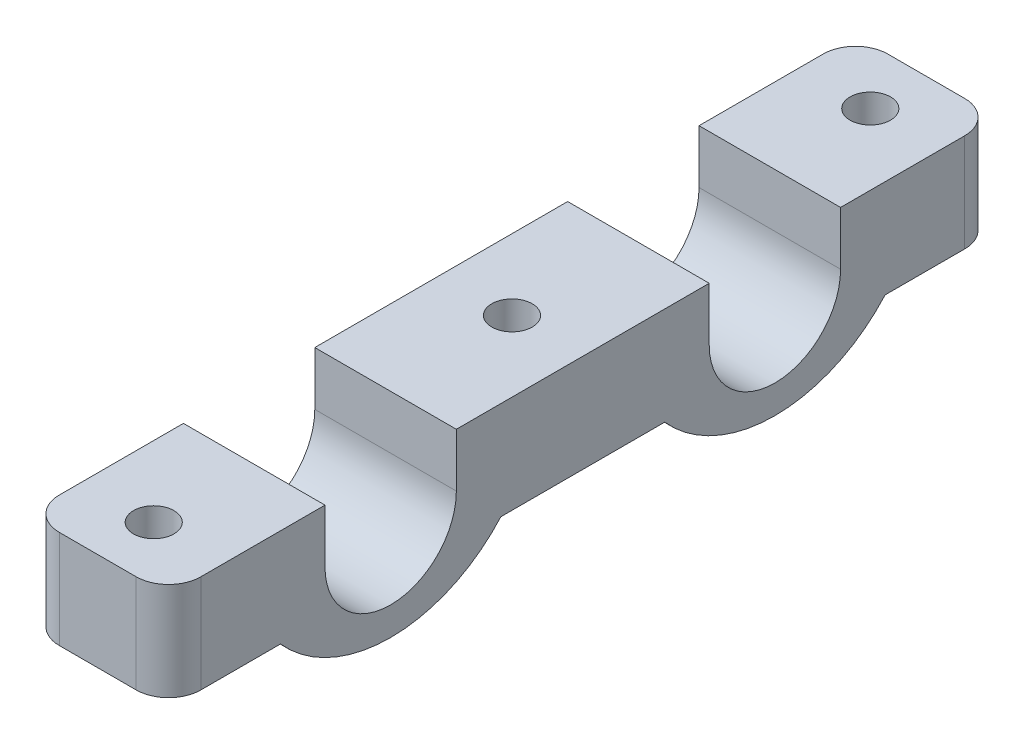
ISO-10303-21;
HEADER;
FILE_DESCRIPTION(('STEP AP214'),'2;1');
FILE_NAME('part.step','',(''),(''),'','','');
FILE_SCHEMA(('AUTOMOTIVE_DESIGN { 1 0 10303 214 1 1 1 1 }'));
ENDSEC;
DATA;
#1=APPLICATION_CONTEXT('core data for automotive mechanical design processes');
#2=APPLICATION_PROTOCOL_DEFINITION('international standard','automotive_design',2000,#1);
#3=PRODUCT_CONTEXT('',#1,'mechanical');
#4=PRODUCT('Part','Part','',(#3));
#5=PRODUCT_RELATED_PRODUCT_CATEGORY('part','',(#4));
#6=PRODUCT_DEFINITION_FORMATION('','',#4);
#7=PRODUCT_DEFINITION_CONTEXT('part definition',#1,'design');
#8=PRODUCT_DEFINITION('design','',#6,#7);
#9=PRODUCT_DEFINITION_SHAPE('','',#8);
#10=(LENGTH_UNIT() NAMED_UNIT(*) SI_UNIT(.MILLI.,.METRE.));
#11=(NAMED_UNIT(*) PLANE_ANGLE_UNIT() SI_UNIT($,.RADIAN.));
#12=(NAMED_UNIT(*) SI_UNIT($,.STERADIAN.) SOLID_ANGLE_UNIT());
#13=UNCERTAINTY_MEASURE_WITH_UNIT(LENGTH_MEASURE(1.E-05),#10,'distance_accuracy_value','');
#14=(GEOMETRIC_REPRESENTATION_CONTEXT(3) GLOBAL_UNCERTAINTY_ASSIGNED_CONTEXT((#13)) GLOBAL_UNIT_ASSIGNED_CONTEXT((#10,
#11,#12)) REPRESENTATION_CONTEXT('',''));
#15=CARTESIAN_POINT('',(0.,0.,0.));
#16=DIRECTION('',(0.,0.,1.));
#17=DIRECTION('',(1.,0.,0.));
#18=AXIS2_PLACEMENT_3D('',#15,#16,#17);
#19=CARTESIAN_POINT('',(17.5,-23.241,-47.5));
#20=DIRECTION('',(0.,1.,0.));
#21=DIRECTION('',(0.,0.,1.));
#22=AXIS2_PLACEMENT_3D('',#19,#20,#21);
#23=CYLINDRICAL_SURFACE('',#22,5.);
#24=CARTESIAN_POINT('',(17.5,13.24,-47.5));
#25=DIRECTION('',(0.,1.,0.));
#26=DIRECTION('',(0.,0.,1.));
#27=AXIS2_PLACEMENT_3D('',#24,#25,#26);
#28=CIRCLE('',#27,5.);
#29=CARTESIAN_POINT('',(17.5,13.24,-42.5));
#30=VERTEX_POINT('',#29);
#31=EDGE_CURVE('E686',#30,#30,#28,.T.);
#32=ORIENTED_EDGE('',*,*,#31,.T.);
#33=EDGE_LOOP('',(#32));
#34=FACE_BOUND('',#33,.T.);
#35=CARTESIAN_POINT('',(17.5,-0.999999999999997,-47.5));
#36=DIRECTION('',(0.,-1.,0.));
#37=DIRECTION('',(0.,0.,-1.));
#38=AXIS2_PLACEMENT_3D('',#35,#36,#37);
#39=CIRCLE('',#38,5.);
#40=CARTESIAN_POINT('',(17.5,-0.999999999999997,-52.5));
#41=VERTEX_POINT('',#40);
#42=EDGE_CURVE('E220',#41,#41,#39,.F.);
#43=ORIENTED_EDGE('',*,*,#42,.F.);
#44=EDGE_LOOP('',(#43));
#45=FACE_BOUND('',#44,.T.);
#46=ADVANCED_FACE('F41',(#34,#45),#23,.F.);
#47=CARTESIAN_POINT('',(17.5,-23.241,-136.080112359044));
#48=DIRECTION('',(0.,1.,0.));
#49=DIRECTION('',(0.,0.,1.));
#50=AXIS2_PLACEMENT_3D('',#47,#48,#49);
#51=CYLINDRICAL_SURFACE('',#50,5.);
#52=CARTESIAN_POINT('',(17.5,13.24,-136.080112359044));
#53=DIRECTION('',(0.,1.,0.));
#54=DIRECTION('',(0.,0.,-1.));
#55=AXIS2_PLACEMENT_3D('',#52,#53,#54);
#56=CIRCLE('',#55,5.);
#57=CARTESIAN_POINT('',(17.5,13.24,-141.080112359044));
#58=VERTEX_POINT('',#57);
#59=EDGE_CURVE('E225',#58,#58,#56,.T.);
#60=ORIENTED_EDGE('',*,*,#59,.T.);
#61=EDGE_LOOP('',(#60));
#62=FACE_BOUND('',#61,.T.);
#63=CARTESIAN_POINT('',(17.5,-0.999999999999997,-136.080112359044));
#64=DIRECTION('',(0.,-1.,0.));
#65=DIRECTION('',(0.,0.,-1.));
#66=AXIS2_PLACEMENT_3D('',#63,#64,#65);
#67=CIRCLE('',#66,5.);
#68=CARTESIAN_POINT('',(17.5,-0.999999999999997,-141.080112359044));
#69=VERTEX_POINT('',#68);
#70=EDGE_CURVE('E216',#69,#69,#67,.F.);
#71=ORIENTED_EDGE('',*,*,#70,.F.);
#72=EDGE_LOOP('',(#71));
#73=FACE_BOUND('',#72,.T.);
#74=ADVANCED_FACE('F402',(#62,#73),#51,.F.);
#75=CARTESIAN_POINT('',(17.5,-23.241,41.080112359044));
#76=DIRECTION('',(0.,1.,0.));
#77=DIRECTION('',(0.,0.,1.));
#78=AXIS2_PLACEMENT_3D('',#75,#76,#77);
#79=CYLINDRICAL_SURFACE('',#78,5.);
#80=CARTESIAN_POINT('',(17.5,13.24,41.080112359044));
#81=DIRECTION('',(0.,1.,0.));
#82=DIRECTION('',(0.,0.,1.));
#83=AXIS2_PLACEMENT_3D('',#80,#81,#82);
#84=CIRCLE('',#83,5.);
#85=CARTESIAN_POINT('',(17.5,13.24,46.080112359044));
#86=VERTEX_POINT('',#85);
#87=EDGE_CURVE('E371',#86,#86,#84,.T.);
#88=ORIENTED_EDGE('',*,*,#87,.T.);
#89=EDGE_LOOP('',(#88));
#90=FACE_BOUND('',#89,.T.);
#91=CARTESIAN_POINT('',(17.5,-0.999999999999997,41.080112359044));
#92=DIRECTION('',(0.,-1.,0.));
#93=DIRECTION('',(0.,0.,-1.));
#94=AXIS2_PLACEMENT_3D('',#91,#92,#93);
#95=CIRCLE('',#94,5.);
#96=CARTESIAN_POINT('',(17.5,-0.999999999999997,36.080112359044));
#97=VERTEX_POINT('',#96);
#98=EDGE_CURVE('E214',#97,#97,#95,.F.);
#99=ORIENTED_EDGE('',*,*,#98,.F.);
#100=EDGE_LOOP('',(#99));
#101=FACE_BOUND('',#100,.T.);
#102=ADVANCED_FACE('F409',(#90,#101),#79,.F.);
#103=CARTESIAN_POINT('',(35.,0.,0.));
#104=DIRECTION('',(-1.,0.,0.));
#105=DIRECTION('',(0.,0.,1.));
#106=AXIS2_PLACEMENT_3D('',#103,#104,#105);
#107=CYLINDRICAL_SURFACE('',#106,16.24);
#108=CARTESIAN_POINT('',(0.,0.,0.));
#109=DIRECTION('',(-1.,0.,0.));
#110=DIRECTION('',(0.,0.,-1.));
#111=AXIS2_PLACEMENT_3D('',#108,#109,#110);
#112=CIRCLE('',#111,16.24);
#113=CARTESIAN_POINT('',(0.,0.,-16.24));
#114=VERTEX_POINT('',#113);
#115=CARTESIAN_POINT('',(0.,0.,16.24));
#116=VERTEX_POINT('',#115);
#117=EDGE_CURVE('E201',#114,#116,#112,.T.);
#118=ORIENTED_EDGE('',*,*,#117,.T.);
#119=DIRECTION('',(-1.,0.,0.));
#120=VECTOR('',#119,1.);
#121=CARTESIAN_POINT('',(35.,0.,16.24));
#122=LINE('',#121,#120);
#123=CARTESIAN_POINT('',(35.,0.,16.24));
#124=VERTEX_POINT('',#123);
#125=EDGE_CURVE('E185',#124,#116,#122,.T.);
#126=ORIENTED_EDGE('',*,*,#125,.F.);
#127=CARTESIAN_POINT('',(35.,0.,0.));
#128=DIRECTION('',(-1.,0.,0.));
#129=DIRECTION('',(0.,0.,-1.));
#130=AXIS2_PLACEMENT_3D('',#127,#128,#129);
#131=CIRCLE('',#130,16.24);
#132=CARTESIAN_POINT('',(35.,0.,-16.24));
#133=VERTEX_POINT('',#132);
#134=EDGE_CURVE('E188',#133,#124,#131,.T.);
#135=ORIENTED_EDGE('',*,*,#134,.F.);
#136=DIRECTION('',(-1.,0.,0.));
#137=VECTOR('',#136,1.);
#138=CARTESIAN_POINT('',(35.,0.,-16.24));
#139=LINE('',#138,#137);
#140=EDGE_CURVE('E335',#133,#114,#139,.T.);
#141=ORIENTED_EDGE('',*,*,#140,.T.);
#142=EDGE_LOOP('',(#118,#126,#135,#141));
#143=FACE_BOUND('',#142,.T.);
#144=ADVANCED_FACE('F203',(#143),#107,.F.);
#145=CARTESIAN_POINT('',(35.,13.24,16.24));
#146=DIRECTION('',(0.,0.,1.));
#147=DIRECTION('',(1.,0.,0.));
#148=AXIS2_PLACEMENT_3D('',#145,#146,#147);
#149=PLANE('',#148);
#150=DIRECTION('',(0.,1.,0.));
#151=VECTOR('',#150,1.);
#152=CARTESIAN_POINT('',(0.,13.24,16.24));
#153=LINE('',#152,#151);
#154=CARTESIAN_POINT('',(0.,13.24,16.24));
#155=VERTEX_POINT('',#154);
#156=EDGE_CURVE('E315',#116,#155,#153,.T.);
#157=ORIENTED_EDGE('',*,*,#156,.T.);
#158=DIRECTION('',(-1.,0.,0.));
#159=VECTOR('',#158,1.);
#160=CARTESIAN_POINT('',(35.,13.24,16.24));
#161=LINE('',#160,#159);
#162=CARTESIAN_POINT('',(35.,13.24,16.24));
#163=VERTEX_POINT('',#162);
#164=EDGE_CURVE('E184',#163,#155,#161,.T.);
#165=ORIENTED_EDGE('',*,*,#164,.F.);
#166=DIRECTION('',(0.,1.,0.));
#167=VECTOR('',#166,1.);
#168=CARTESIAN_POINT('',(35.,13.24,16.24));
#169=LINE('',#168,#167);
#170=EDGE_CURVE('E178',#124,#163,#169,.T.);
#171=ORIENTED_EDGE('',*,*,#170,.F.);
#172=ORIENTED_EDGE('',*,*,#125,.T.);
#173=EDGE_LOOP('',(#157,#165,#171,#172));
#174=FACE_BOUND('',#173,.T.);
#175=ADVANCED_FACE('F179',(#174),#149,.F.);
#176=CARTESIAN_POINT('',(35.,13.24,54.9202247180879));
#177=DIRECTION('',(0.,-1.,0.));
#178=DIRECTION('',(0.,0.,-1.));
#179=AXIS2_PLACEMENT_3D('',#176,#177,#178);
#180=PLANE('',#179);
#181=ORIENTED_EDGE('',*,*,#87,.F.);
#182=EDGE_LOOP('',(#181));
#183=FACE_BOUND('',#182,.T.);
#184=DIRECTION('',(-1.,0.,0.));
#185=VECTOR('',#184,1.);
#186=CARTESIAN_POINT('',(35.,13.24,54.9202247180879));
#187=LINE('',#186,#185);
#188=CARTESIAN_POINT('',(27.,13.24,54.9202247180879));
#189=VERTEX_POINT('',#188);
#190=CARTESIAN_POINT('',(8.,13.24,54.9202247180879));
#191=VERTEX_POINT('',#190);
#192=EDGE_CURVE('E209',#189,#191,#187,.T.);
#193=ORIENTED_EDGE('',*,*,#192,.F.);
#194=CARTESIAN_POINT('',(27.,13.24,46.9202247180879));
#195=DIRECTION('',(0.,-1.,0.));
#196=DIRECTION('',(0.,0.,-1.));
#197=AXIS2_PLACEMENT_3D('',#194,#195,#196);
#198=CIRCLE('',#197,8.);
#199=CARTESIAN_POINT('',(35.,13.24,46.9202247180879));
#200=VERTEX_POINT('',#199);
#201=EDGE_CURVE('E240',#189,#200,#198,.F.);
#202=ORIENTED_EDGE('',*,*,#201,.T.);
#203=DIRECTION('',(0.,0.,1.));
#204=VECTOR('',#203,1.);
#205=CARTESIAN_POINT('',(35.,13.24,54.9202247180879));
#206=LINE('',#205,#204);
#207=EDGE_CURVE('E186',#163,#200,#206,.T.);
#208=ORIENTED_EDGE('',*,*,#207,.F.);
#209=ORIENTED_EDGE('',*,*,#164,.T.);
#210=DIRECTION('',(0.,0.,1.));
#211=VECTOR('',#210,1.);
#212=CARTESIAN_POINT('',(0.,13.24,54.9202247180879));
#213=LINE('',#212,#211);
#214=CARTESIAN_POINT('',(0.,13.24,46.9202247180879));
#215=VERTEX_POINT('',#214);
#216=EDGE_CURVE('E308',#155,#215,#213,.T.);
#217=ORIENTED_EDGE('',*,*,#216,.T.);
#218=CARTESIAN_POINT('',(8.,13.24,46.9202247180879));
#219=DIRECTION('',(0.,-1.,0.));
#220=DIRECTION('',(0.,0.,-1.));
#221=AXIS2_PLACEMENT_3D('',#218,#219,#220);
#222=CIRCLE('',#221,8.);
#223=EDGE_CURVE('E232',#215,#191,#222,.F.);
#224=ORIENTED_EDGE('',*,*,#223,.T.);
#225=EDGE_LOOP('',(#193,#202,#208,#209,#217,#224));
#226=FACE_BOUND('',#225,.T.);
#227=ADVANCED_FACE('F375',(#183,#226),#180,.F.);
#228=CARTESIAN_POINT('',(35.,0.,54.9202247180879));
#229=DIRECTION('',(0.,0.,-1.));
#230=DIRECTION('',(-1.,0.,0.));
#231=AXIS2_PLACEMENT_3D('',#228,#229,#230);
#232=PLANE('',#231);
#233=DIRECTION('',(-1.,0.,0.));
#234=VECTOR('',#233,1.);
#235=CARTESIAN_POINT('',(35.,-11.,54.9202247180879));
#236=LINE('',#235,#234);
#237=CARTESIAN_POINT('',(27.,-11.,54.9202247180879));
#238=VERTEX_POINT('',#237);
#239=CARTESIAN_POINT('',(8.,-11.,54.9202247180879));
#240=VERTEX_POINT('',#239);
#241=EDGE_CURVE('E278',#238,#240,#236,.T.);
#242=ORIENTED_EDGE('',*,*,#241,.F.);
#243=DIRECTION('',(0.,-1.,0.));
#244=VECTOR('',#243,1.);
#245=CARTESIAN_POINT('',(27.,13.24,54.9202247180879));
#246=LINE('',#245,#244);
#247=EDGE_CURVE('E231',#238,#189,#246,.F.);
#248=ORIENTED_EDGE('',*,*,#247,.T.);
#249=ORIENTED_EDGE('',*,*,#192,.T.);
#250=DIRECTION('',(0.,-1.,0.));
#251=VECTOR('',#250,1.);
#252=CARTESIAN_POINT('',(8.,0.,54.9202247180879));
#253=LINE('',#252,#251);
#254=EDGE_CURVE('E229',#191,#240,#253,.T.);
#255=ORIENTED_EDGE('',*,*,#254,.T.);
#256=EDGE_LOOP('',(#242,#248,#249,#255));
#257=FACE_BOUND('',#256,.T.);
#258=ADVANCED_FACE('F290',(#257),#232,.F.);
#259=CARTESIAN_POINT('',(35.,-11.,27.24));
#260=DIRECTION('',(0.,1.,0.));
#261=DIRECTION('',(0.,0.,1.));
#262=AXIS2_PLACEMENT_3D('',#259,#260,#261);
#263=PLANE('',#262);
#264=CARTESIAN_POINT('',(17.5,-11.,41.080112359044));
#265=DIRECTION('',(0.,-1.,0.));
#266=DIRECTION('',(0.,0.,-1.));
#267=AXIS2_PLACEMENT_3D('',#264,#265,#266);
#268=CIRCLE('',#267,10.5);
#269=CARTESIAN_POINT('',(17.5,-11.,30.580112359044));
#270=VERTEX_POINT('',#269);
#271=EDGE_CURVE('E710',#270,#270,#268,.T.);
#272=ORIENTED_EDGE('',*,*,#271,.F.);
#273=EDGE_LOOP('',(#272));
#274=FACE_BOUND('',#273,.T.);
#275=DIRECTION('',(0.,0.,-1.));
#276=VECTOR('',#275,1.);
#277=CARTESIAN_POINT('',(35.,-11.,27.24));
#278=LINE('',#277,#276);
#279=CARTESIAN_POINT('',(35.,-11.,46.9202247180879));
#280=VERTEX_POINT('',#279);
#281=CARTESIAN_POINT('',(35.,-11.,27.24));
#282=VERTEX_POINT('',#281);
#283=EDGE_CURVE('E372',#280,#282,#278,.T.);
#284=ORIENTED_EDGE('',*,*,#283,.F.);
#285=CARTESIAN_POINT('',(27.,-11.,46.9202247180879));
#286=DIRECTION('',(0.,1.,0.));
#287=DIRECTION('',(0.,0.,1.));
#288=AXIS2_PLACEMENT_3D('',#285,#286,#287);
#289=CIRCLE('',#288,8.);
#290=EDGE_CURVE('E226',#280,#238,#289,.F.);
#291=ORIENTED_EDGE('',*,*,#290,.T.);
#292=ORIENTED_EDGE('',*,*,#241,.T.);
#293=CARTESIAN_POINT('',(8.,-11.,46.9202247180879));
#294=DIRECTION('',(0.,1.,0.));
#295=DIRECTION('',(0.,0.,1.));
#296=AXIS2_PLACEMENT_3D('',#293,#294,#295);
#297=CIRCLE('',#296,8.);
#298=CARTESIAN_POINT('',(0.,-11.,46.9202247180879));
#299=VERTEX_POINT('',#298);
#300=EDGE_CURVE('E228',#240,#299,#297,.F.);
#301=ORIENTED_EDGE('',*,*,#300,.T.);
#302=DIRECTION('',(0.,0.,-1.));
#303=VECTOR('',#302,1.);
#304=CARTESIAN_POINT('',(0.,-11.,27.24));
#305=LINE('',#304,#303);
#306=CARTESIAN_POINT('',(0.,-11.,27.24));
#307=VERTEX_POINT('',#306);
#308=EDGE_CURVE('E297',#299,#307,#305,.T.);
#309=ORIENTED_EDGE('',*,*,#308,.T.);
#310=DIRECTION('',(-1.,0.,0.));
#311=VECTOR('',#310,1.);
#312=CARTESIAN_POINT('',(35.,-11.,27.24));
#313=LINE('',#312,#311);
#314=EDGE_CURVE('E280',#282,#307,#313,.T.);
#315=ORIENTED_EDGE('',*,*,#314,.F.);
#316=EDGE_LOOP('',(#284,#291,#292,#301,#309,#315));
#317=FACE_BOUND('',#316,.T.);
#318=ADVANCED_FACE('F296',(#274,#317),#263,.F.);
#319=CARTESIAN_POINT('',(35.,13.1911764705882,0.));
#320=DIRECTION('',(-1.,0.,0.));
#321=DIRECTION('',(0.,0.,1.));
#322=AXIS2_PLACEMENT_3D('',#319,#320,#321);
#323=CYLINDRICAL_SURFACE('',#322,36.4311764705882);
#324=CARTESIAN_POINT('',(0.,13.1911764705882,0.));
#325=DIRECTION('',(1.,0.,0.));
#326=DIRECTION('',(0.,0.,-1.));
#327=AXIS2_PLACEMENT_3D('',#324,#325,#326);
#328=CIRCLE('',#327,36.4311764705882);
#329=CARTESIAN_POINT('',(0.,-11.,-27.24));
#330=VERTEX_POINT('',#329);
#331=EDGE_CURVE('E310',#307,#330,#328,.T.);
#332=ORIENTED_EDGE('',*,*,#331,.T.);
#333=DIRECTION('',(-1.,0.,0.));
#334=VECTOR('',#333,1.);
#335=CARTESIAN_POINT('',(35.,-11.,-27.24));
#336=LINE('',#335,#334);
#337=CARTESIAN_POINT('',(35.,-11.,-27.24));
#338=VERTEX_POINT('',#337);
#339=EDGE_CURVE('E274',#338,#330,#336,.T.);
#340=ORIENTED_EDGE('',*,*,#339,.F.);
#341=CARTESIAN_POINT('',(35.,13.1911764705882,0.));
#342=DIRECTION('',(1.,0.,0.));
#343=DIRECTION('',(0.,0.,-1.));
#344=AXIS2_PLACEMENT_3D('',#341,#342,#343);
#345=CIRCLE('',#344,36.4311764705882);
#346=EDGE_CURVE('E376',#282,#338,#345,.T.);
#347=ORIENTED_EDGE('',*,*,#346,.F.);
#348=ORIENTED_EDGE('',*,*,#314,.T.);
#349=EDGE_LOOP('',(#332,#340,#347,#348));
#350=FACE_BOUND('',#349,.T.);
#351=ADVANCED_FACE('F446',(#350),#323,.T.);
#352=CARTESIAN_POINT('',(35.,-11.,-27.24));
#353=DIRECTION('',(0.,1.,0.));
#354=DIRECTION('',(0.,0.,1.));
#355=AXIS2_PLACEMENT_3D('',#352,#353,#354);
#356=PLANE('',#355);
#357=CARTESIAN_POINT('',(17.5,-11.,-47.5));
#358=DIRECTION('',(0.,-1.,0.));
#359=DIRECTION('',(0.,0.,-1.));
#360=AXIS2_PLACEMENT_3D('',#357,#358,#359);
#361=CIRCLE('',#360,10.5);
#362=CARTESIAN_POINT('',(17.5,-11.,-58.));
#363=VERTEX_POINT('',#362);
#364=EDGE_CURVE('E695',#363,#363,#361,.T.);
#365=ORIENTED_EDGE('',*,*,#364,.F.);
#366=EDGE_LOOP('',(#365));
#367=FACE_BOUND('',#366,.T.);
#368=DIRECTION('',(0.,0.,-1.));
#369=VECTOR('',#368,1.);
#370=CARTESIAN_POINT('',(0.,-11.,-27.24));
#371=LINE('',#370,#369);
#372=CARTESIAN_POINT('',(0.,-11.,-67.76));
#373=VERTEX_POINT('',#372);
#374=EDGE_CURVE('E309',#330,#373,#371,.T.);
#375=ORIENTED_EDGE('',*,*,#374,.T.);
#376=DIRECTION('',(-1.,0.,0.));
#377=VECTOR('',#376,1.);
#378=CARTESIAN_POINT('',(35.,-11.,-67.76));
#379=LINE('',#378,#377);
#380=CARTESIAN_POINT('',(35.,-11.,-67.76));
#381=VERTEX_POINT('',#380);
#382=EDGE_CURVE('E272',#381,#373,#379,.T.);
#383=ORIENTED_EDGE('',*,*,#382,.F.);
#384=DIRECTION('',(0.,0.,-1.));
#385=VECTOR('',#384,1.);
#386=CARTESIAN_POINT('',(35.,-11.,-27.24));
#387=LINE('',#386,#385);
#388=EDGE_CURVE('E379',#338,#381,#387,.T.);
#389=ORIENTED_EDGE('',*,*,#388,.F.);
#390=ORIENTED_EDGE('',*,*,#339,.T.);
#391=EDGE_LOOP('',(#375,#383,#389,#390));
#392=FACE_BOUND('',#391,.T.);
#393=ADVANCED_FACE('F444',(#367,#392),#356,.F.);
#394=CARTESIAN_POINT('',(35.,13.1911764705882,-95.));
#395=DIRECTION('',(-1.,0.,0.));
#396=DIRECTION('',(0.,0.,1.));
#397=AXIS2_PLACEMENT_3D('',#394,#395,#396);
#398=CYLINDRICAL_SURFACE('',#397,36.4311764705882);
#399=CARTESIAN_POINT('',(0.,13.1911764705882,-95.));
#400=DIRECTION('',(1.,0.,0.));
#401=DIRECTION('',(0.,0.,-1.));
#402=AXIS2_PLACEMENT_3D('',#399,#400,#401);
#403=CIRCLE('',#402,36.4311764705882);
#404=CARTESIAN_POINT('',(0.,-11.,-122.24));
#405=VERTEX_POINT('',#404);
#406=EDGE_CURVE('E320',#373,#405,#403,.T.);
#407=ORIENTED_EDGE('',*,*,#406,.T.);
#408=DIRECTION('',(-1.,0.,0.));
#409=VECTOR('',#408,1.);
#410=CARTESIAN_POINT('',(35.,-11.,-122.24));
#411=LINE('',#410,#409);
#412=CARTESIAN_POINT('',(35.,-11.,-122.24));
#413=VERTEX_POINT('',#412);
#414=EDGE_CURVE('E262',#413,#405,#411,.T.);
#415=ORIENTED_EDGE('',*,*,#414,.F.);
#416=CARTESIAN_POINT('',(35.,13.1911764705882,-95.));
#417=DIRECTION('',(1.,0.,0.));
#418=DIRECTION('',(0.,0.,-1.));
#419=AXIS2_PLACEMENT_3D('',#416,#417,#418);
#420=CIRCLE('',#419,36.4311764705882);
#421=EDGE_CURVE('E385',#381,#413,#420,.T.);
#422=ORIENTED_EDGE('',*,*,#421,.F.);
#423=ORIENTED_EDGE('',*,*,#382,.T.);
#424=EDGE_LOOP('',(#407,#415,#422,#423));
#425=FACE_BOUND('',#424,.T.);
#426=ADVANCED_FACE('F441',(#425),#398,.T.);
#427=CARTESIAN_POINT('',(35.,-11.,-122.24));
#428=DIRECTION('',(0.,1.,0.));
#429=DIRECTION('',(0.,0.,1.));
#430=AXIS2_PLACEMENT_3D('',#427,#428,#429);
#431=PLANE('',#430);
#432=CARTESIAN_POINT('',(17.5,-11.,-136.080112359044));
#433=DIRECTION('',(0.,-1.,0.));
#434=DIRECTION('',(0.,0.,-1.));
#435=AXIS2_PLACEMENT_3D('',#432,#433,#434);
#436=CIRCLE('',#435,10.5);
#437=CARTESIAN_POINT('',(17.5,-11.,-146.580112359044));
#438=VERTEX_POINT('',#437);
#439=EDGE_CURVE('E701',#438,#438,#436,.T.);
#440=ORIENTED_EDGE('',*,*,#439,.F.);
#441=EDGE_LOOP('',(#440));
#442=FACE_BOUND('',#441,.T.);
#443=DIRECTION('',(-1.,0.,0.));
#444=VECTOR('',#443,1.);
#445=CARTESIAN_POINT('',(35.,-11.,-149.920224718088));
#446=LINE('',#445,#444);
#447=CARTESIAN_POINT('',(27.,-11.,-149.920224718088));
#448=VERTEX_POINT('',#447);
#449=CARTESIAN_POINT('',(8.,-11.,-149.920224718088));
#450=VERTEX_POINT('',#449);
#451=EDGE_CURVE('E251',#448,#450,#446,.T.);
#452=ORIENTED_EDGE('',*,*,#451,.F.);
#453=CARTESIAN_POINT('',(27.,-11.,-141.920224718088));
#454=DIRECTION('',(0.,1.,0.));
#455=DIRECTION('',(0.,0.,1.));
#456=AXIS2_PLACEMENT_3D('',#453,#454,#455);
#457=CIRCLE('',#456,8.);
#458=CARTESIAN_POINT('',(35.,-11.,-141.920224718088));
#459=VERTEX_POINT('',#458);
#460=EDGE_CURVE('E11',#448,#459,#457,.F.);
#461=ORIENTED_EDGE('',*,*,#460,.T.);
#462=DIRECTION('',(0.,0.,-1.));
#463=VECTOR('',#462,1.);
#464=CARTESIAN_POINT('',(35.,-11.,-122.24));
#465=LINE('',#464,#463);
#466=EDGE_CURVE('E381',#413,#459,#465,.T.);
#467=ORIENTED_EDGE('',*,*,#466,.F.);
#468=ORIENTED_EDGE('',*,*,#414,.T.);
#469=DIRECTION('',(0.,0.,-1.));
#470=VECTOR('',#469,1.);
#471=CARTESIAN_POINT('',(0.,-11.,-122.24));
#472=LINE('',#471,#470);
#473=CARTESIAN_POINT('',(0.,-11.,-141.920224718088));
#474=VERTEX_POINT('',#473);
#475=EDGE_CURVE('E316',#405,#474,#472,.T.);
#476=ORIENTED_EDGE('',*,*,#475,.T.);
#477=CARTESIAN_POINT('',(8.,-11.,-141.920224718088));
#478=DIRECTION('',(0.,1.,0.));
#479=DIRECTION('',(0.,0.,1.));
#480=AXIS2_PLACEMENT_3D('',#477,#478,#479);
#481=CIRCLE('',#480,8.);
#482=EDGE_CURVE('E47',#474,#450,#481,.F.);
#483=ORIENTED_EDGE('',*,*,#482,.T.);
#484=EDGE_LOOP('',(#452,#461,#467,#468,#476,#483));
#485=FACE_BOUND('',#484,.T.);
#486=ADVANCED_FACE('F438',(#442,#485),#431,.F.);
#487=CARTESIAN_POINT('',(35.,13.24,-149.920224718088));
#488=DIRECTION('',(0.,0.,1.));
#489=DIRECTION('',(1.,0.,0.));
#490=AXIS2_PLACEMENT_3D('',#487,#488,#489);
#491=PLANE('',#490);
#492=DIRECTION('',(-1.,0.,0.));
#493=VECTOR('',#492,1.);
#494=CARTESIAN_POINT('',(35.,13.24,-149.920224718088));
#495=LINE('',#494,#493);
#496=CARTESIAN_POINT('',(27.,13.24,-149.920224718088));
#497=VERTEX_POINT('',#496);
#498=CARTESIAN_POINT('',(8.,13.24,-149.920224718088));
#499=VERTEX_POINT('',#498);
#500=EDGE_CURVE('E254',#497,#499,#495,.T.);
#501=ORIENTED_EDGE('',*,*,#500,.F.);
#502=DIRECTION('',(0.,1.,0.));
#503=VECTOR('',#502,1.);
#504=CARTESIAN_POINT('',(27.,-11.,-149.920224718088));
#505=LINE('',#504,#503);
#506=EDGE_CURVE('E65',#497,#448,#505,.F.);
#507=ORIENTED_EDGE('',*,*,#506,.T.);
#508=ORIENTED_EDGE('',*,*,#451,.T.);
#509=DIRECTION('',(0.,1.,0.));
#510=VECTOR('',#509,1.);
#511=CARTESIAN_POINT('',(8.,13.24,-149.920224718088));
#512=LINE('',#511,#510);
#513=EDGE_CURVE('E250',#450,#499,#512,.T.);
#514=ORIENTED_EDGE('',*,*,#513,.T.);
#515=EDGE_LOOP('',(#501,#507,#508,#514));
#516=FACE_BOUND('',#515,.T.);
#517=ADVANCED_FACE('F255',(#516),#491,.F.);
#518=CARTESIAN_POINT('',(35.,13.24,-111.24));
#519=DIRECTION('',(0.,-1.,0.));
#520=DIRECTION('',(0.,0.,-1.));
#521=AXIS2_PLACEMENT_3D('',#518,#519,#520);
#522=PLANE('',#521);
#523=ORIENTED_EDGE('',*,*,#59,.F.);
#524=EDGE_LOOP('',(#523));
#525=FACE_BOUND('',#524,.T.);
#526=DIRECTION('',(0.,0.,1.));
#527=VECTOR('',#526,1.);
#528=CARTESIAN_POINT('',(35.,13.24,-111.24));
#529=LINE('',#528,#527);
#530=CARTESIAN_POINT('',(35.,13.24,-141.920224718088));
#531=VERTEX_POINT('',#530);
#532=CARTESIAN_POINT('',(35.,13.24,-111.24));
#533=VERTEX_POINT('',#532);
#534=EDGE_CURVE('E390',#531,#533,#529,.T.);
#535=ORIENTED_EDGE('',*,*,#534,.F.);
#536=CARTESIAN_POINT('',(27.,13.24,-141.920224718088));
#537=DIRECTION('',(0.,-1.,0.));
#538=DIRECTION('',(0.,0.,-1.));
#539=AXIS2_PLACEMENT_3D('',#536,#537,#538);
#540=CIRCLE('',#539,8.);
#541=EDGE_CURVE('E244',#531,#497,#540,.F.);
#542=ORIENTED_EDGE('',*,*,#541,.T.);
#543=ORIENTED_EDGE('',*,*,#500,.T.);
#544=CARTESIAN_POINT('',(8.,13.24,-141.920224718088));
#545=DIRECTION('',(0.,-1.,0.));
#546=DIRECTION('',(0.,0.,-1.));
#547=AXIS2_PLACEMENT_3D('',#544,#545,#546);
#548=CIRCLE('',#547,8.);
#549=CARTESIAN_POINT('',(0.,13.24,-141.920224718088));
#550=VERTEX_POINT('',#549);
#551=EDGE_CURVE('E243',#499,#550,#548,.F.);
#552=ORIENTED_EDGE('',*,*,#551,.T.);
#553=DIRECTION('',(0.,0.,1.));
#554=VECTOR('',#553,1.);
#555=CARTESIAN_POINT('',(0.,13.24,-111.24));
#556=LINE('',#555,#554);
#557=CARTESIAN_POINT('',(0.,13.24,-111.24));
#558=VERTEX_POINT('',#557);
#559=EDGE_CURVE('E322',#550,#558,#556,.T.);
#560=ORIENTED_EDGE('',*,*,#559,.T.);
#561=DIRECTION('',(-1.,0.,0.));
#562=VECTOR('',#561,1.);
#563=CARTESIAN_POINT('',(35.,13.24,-111.24));
#564=LINE('',#563,#562);
#565=EDGE_CURVE('E258',#533,#558,#564,.T.);
#566=ORIENTED_EDGE('',*,*,#565,.F.);
#567=EDGE_LOOP('',(#535,#542,#543,#552,#560,#566));
#568=FACE_BOUND('',#567,.T.);
#569=ADVANCED_FACE('F259',(#525,#568),#522,.F.);
#570=CARTESIAN_POINT('',(35.,0.,-111.24));
#571=DIRECTION('',(0.,0.,-1.));
#572=DIRECTION('',(-1.,0.,0.));
#573=AXIS2_PLACEMENT_3D('',#570,#571,#572);
#574=PLANE('',#573);
#575=DIRECTION('',(0.,-1.,0.));
#576=VECTOR('',#575,1.);
#577=CARTESIAN_POINT('',(0.,0.,-111.24));
#578=LINE('',#577,#576);
#579=CARTESIAN_POINT('',(0.,0.,-111.24));
#580=VERTEX_POINT('',#579);
#581=EDGE_CURVE('E324',#558,#580,#578,.T.);
#582=ORIENTED_EDGE('',*,*,#581,.T.);
#583=DIRECTION('',(-1.,0.,0.));
#584=VECTOR('',#583,1.);
#585=CARTESIAN_POINT('',(35.,0.,-111.24));
#586=LINE('',#585,#584);
#587=CARTESIAN_POINT('',(35.,0.,-111.24));
#588=VERTEX_POINT('',#587);
#589=EDGE_CURVE('E265',#588,#580,#586,.T.);
#590=ORIENTED_EDGE('',*,*,#589,.F.);
#591=DIRECTION('',(0.,-1.,0.));
#592=VECTOR('',#591,1.);
#593=CARTESIAN_POINT('',(35.,0.,-111.24));
#594=LINE('',#593,#592);
#595=EDGE_CURVE('E386',#533,#588,#594,.T.);
#596=ORIENTED_EDGE('',*,*,#595,.F.);
#597=ORIENTED_EDGE('',*,*,#565,.T.);
#598=EDGE_LOOP('',(#582,#590,#596,#597));
#599=FACE_BOUND('',#598,.T.);
#600=ADVANCED_FACE('F391',(#599),#574,.F.);
#601=CARTESIAN_POINT('',(35.,0.,-95.));
#602=DIRECTION('',(-1.,0.,0.));
#603=DIRECTION('',(0.,0.,1.));
#604=AXIS2_PLACEMENT_3D('',#601,#602,#603);
#605=CYLINDRICAL_SURFACE('',#604,16.24);
#606=CARTESIAN_POINT('',(0.,0.,-95.));
#607=DIRECTION('',(-1.,0.,0.));
#608=DIRECTION('',(0.,0.,-1.));
#609=AXIS2_PLACEMENT_3D('',#606,#607,#608);
#610=CIRCLE('',#609,16.24);
#611=CARTESIAN_POINT('',(0.,0.,-78.76));
#612=VERTEX_POINT('',#611);
#613=EDGE_CURVE('E323',#580,#612,#610,.T.);
#614=ORIENTED_EDGE('',*,*,#613,.T.);
#615=DIRECTION('',(-1.,0.,0.));
#616=VECTOR('',#615,1.);
#617=CARTESIAN_POINT('',(35.,0.,-78.76));
#618=LINE('',#617,#616);
#619=CARTESIAN_POINT('',(35.,0.,-78.76));
#620=VERTEX_POINT('',#619);
#621=EDGE_CURVE('E338',#620,#612,#618,.T.);
#622=ORIENTED_EDGE('',*,*,#621,.F.);
#623=CARTESIAN_POINT('',(35.,0.,-95.));
#624=DIRECTION('',(-1.,0.,0.));
#625=DIRECTION('',(0.,0.,-1.));
#626=AXIS2_PLACEMENT_3D('',#623,#624,#625);
#627=CIRCLE('',#626,16.24);
#628=EDGE_CURVE('E348',#588,#620,#627,.T.);
#629=ORIENTED_EDGE('',*,*,#628,.F.);
#630=ORIENTED_EDGE('',*,*,#589,.T.);
#631=EDGE_LOOP('',(#614,#622,#629,#630));
#632=FACE_BOUND('',#631,.T.);
#633=ADVANCED_FACE('F347',(#632),#605,.F.);
#634=CARTESIAN_POINT('',(35.,13.24,-78.76));
#635=DIRECTION('',(0.,0.,1.));
#636=DIRECTION('',(1.,0.,0.));
#637=AXIS2_PLACEMENT_3D('',#634,#635,#636);
#638=PLANE('',#637);
#639=DIRECTION('',(0.,1.,0.));
#640=VECTOR('',#639,1.);
#641=CARTESIAN_POINT('',(0.,13.24,-78.76));
#642=LINE('',#641,#640);
#643=CARTESIAN_POINT('',(0.,13.24,-78.76));
#644=VERTEX_POINT('',#643);
#645=EDGE_CURVE('E327',#612,#644,#642,.T.);
#646=ORIENTED_EDGE('',*,*,#645,.T.);
#647=DIRECTION('',(-1.,0.,0.));
#648=VECTOR('',#647,1.);
#649=CARTESIAN_POINT('',(35.,13.24,-78.76));
#650=LINE('',#649,#648);
#651=CARTESIAN_POINT('',(35.,13.24,-78.76));
#652=VERTEX_POINT('',#651);
#653=EDGE_CURVE('E340',#652,#644,#650,.T.);
#654=ORIENTED_EDGE('',*,*,#653,.F.);
#655=DIRECTION('',(0.,1.,0.));
#656=VECTOR('',#655,1.);
#657=CARTESIAN_POINT('',(35.,13.24,-78.76));
#658=LINE('',#657,#656);
#659=EDGE_CURVE('E362',#620,#652,#658,.T.);
#660=ORIENTED_EDGE('',*,*,#659,.F.);
#661=ORIENTED_EDGE('',*,*,#621,.T.);
#662=EDGE_LOOP('',(#646,#654,#660,#661));
#663=FACE_BOUND('',#662,.T.);
#664=ADVANCED_FACE('F356',(#663),#638,.F.);
#665=CARTESIAN_POINT('',(35.,13.24,-16.24));
#666=DIRECTION('',(0.,-1.,0.));
#667=DIRECTION('',(0.,0.,-1.));
#668=AXIS2_PLACEMENT_3D('',#665,#666,#667);
#669=PLANE('',#668);
#670=ORIENTED_EDGE('',*,*,#31,.F.);
#671=EDGE_LOOP('',(#670));
#672=FACE_BOUND('',#671,.T.);
#673=DIRECTION('',(0.,0.,1.));
#674=VECTOR('',#673,1.);
#675=CARTESIAN_POINT('',(0.,13.24,-16.24));
#676=LINE('',#675,#674);
#677=CARTESIAN_POINT('',(0.,13.24,-16.24));
#678=VERTEX_POINT('',#677);
#679=EDGE_CURVE('E328',#644,#678,#676,.T.);
#680=ORIENTED_EDGE('',*,*,#679,.T.);
#681=DIRECTION('',(-1.,0.,0.));
#682=VECTOR('',#681,1.);
#683=CARTESIAN_POINT('',(35.,13.24,-16.24));
#684=LINE('',#683,#682);
#685=CARTESIAN_POINT('',(35.,13.24,-16.24));
#686=VERTEX_POINT('',#685);
#687=EDGE_CURVE('E332',#686,#678,#684,.T.);
#688=ORIENTED_EDGE('',*,*,#687,.F.);
#689=DIRECTION('',(0.,0.,1.));
#690=VECTOR('',#689,1.);
#691=CARTESIAN_POINT('',(35.,13.24,-16.24));
#692=LINE('',#691,#690);
#693=EDGE_CURVE('E364',#652,#686,#692,.T.);
#694=ORIENTED_EDGE('',*,*,#693,.F.);
#695=ORIENTED_EDGE('',*,*,#653,.T.);
#696=EDGE_LOOP('',(#680,#688,#694,#695));
#697=FACE_BOUND('',#696,.T.);
#698=ADVANCED_FACE('F365',(#672,#697),#669,.F.);
#699=CARTESIAN_POINT('',(35.,0.,-16.24));
#700=DIRECTION('',(0.,0.,-1.));
#701=DIRECTION('',(-1.,0.,0.));
#702=AXIS2_PLACEMENT_3D('',#699,#700,#701);
#703=PLANE('',#702);
#704=DIRECTION('',(0.,-1.,0.));
#705=VECTOR('',#704,1.);
#706=CARTESIAN_POINT('',(0.,0.,-16.24));
#707=LINE('',#706,#705);
#708=EDGE_CURVE('E198',#678,#114,#707,.T.);
#709=ORIENTED_EDGE('',*,*,#708,.T.);
#710=ORIENTED_EDGE('',*,*,#140,.F.);
#711=DIRECTION('',(0.,-1.,0.));
#712=VECTOR('',#711,1.);
#713=CARTESIAN_POINT('',(35.,0.,-16.24));
#714=LINE('',#713,#712);
#715=EDGE_CURVE('E193',#686,#133,#714,.T.);
#716=ORIENTED_EDGE('',*,*,#715,.F.);
#717=ORIENTED_EDGE('',*,*,#687,.T.);
#718=EDGE_LOOP('',(#709,#710,#716,#717));
#719=FACE_BOUND('',#718,.T.);
#720=ADVANCED_FACE('F416',(#719),#703,.F.);
#721=CARTESIAN_POINT('',(35.,0.,0.));
#722=DIRECTION('',(1.,0.,0.));
#723=DIRECTION('',(0.,0.,-1.));
#724=AXIS2_PLACEMENT_3D('',#721,#722,#723);
#725=PLANE('',#724);
#726=ORIENTED_EDGE('',*,*,#207,.T.);
#727=DIRECTION('',(0.,-1.,0.));
#728=VECTOR('',#727,1.);
#729=CARTESIAN_POINT('',(35.,-11.,46.9202247180879));
#730=LINE('',#729,#728);
#731=EDGE_CURVE('E210',#200,#280,#730,.T.);
#732=ORIENTED_EDGE('',*,*,#731,.T.);
#733=ORIENTED_EDGE('',*,*,#283,.T.);
#734=ORIENTED_EDGE('',*,*,#346,.T.);
#735=ORIENTED_EDGE('',*,*,#388,.T.);
#736=ORIENTED_EDGE('',*,*,#421,.T.);
#737=ORIENTED_EDGE('',*,*,#466,.T.);
#738=DIRECTION('',(0.,1.,0.));
#739=VECTOR('',#738,1.);
#740=CARTESIAN_POINT('',(35.,13.24,-141.920224718088));
#741=LINE('',#740,#739);
#742=EDGE_CURVE('E202',#459,#531,#741,.T.);
#743=ORIENTED_EDGE('',*,*,#742,.T.);
#744=ORIENTED_EDGE('',*,*,#534,.T.);
#745=ORIENTED_EDGE('',*,*,#595,.T.);
#746=ORIENTED_EDGE('',*,*,#628,.T.);
#747=ORIENTED_EDGE('',*,*,#659,.T.);
#748=ORIENTED_EDGE('',*,*,#693,.T.);
#749=ORIENTED_EDGE('',*,*,#715,.T.);
#750=ORIENTED_EDGE('',*,*,#134,.T.);
#751=ORIENTED_EDGE('',*,*,#170,.T.);
#752=EDGE_LOOP('',(#726,#732,#733,#734,#735,#736,#737,#743,#744,#745,#746,#747,#748,#749,#750,#751));
#753=FACE_BOUND('',#752,.T.);
#754=ADVANCED_FACE('F194',(#753),#725,.T.);
#755=CARTESIAN_POINT('',(0.,0.,0.));
#756=DIRECTION('',(1.,0.,0.));
#757=DIRECTION('',(0.,0.,-1.));
#758=AXIS2_PLACEMENT_3D('',#755,#756,#757);
#759=PLANE('',#758);
#760=ORIENTED_EDGE('',*,*,#308,.F.);
#761=DIRECTION('',(0.,-1.,0.));
#762=VECTOR('',#761,1.);
#763=CARTESIAN_POINT('',(0.,0.,46.9202247180879));
#764=LINE('',#763,#762);
#765=EDGE_CURVE('E241',#299,#215,#764,.F.);
#766=ORIENTED_EDGE('',*,*,#765,.T.);
#767=ORIENTED_EDGE('',*,*,#216,.F.);
#768=ORIENTED_EDGE('',*,*,#156,.F.);
#769=ORIENTED_EDGE('',*,*,#117,.F.);
#770=ORIENTED_EDGE('',*,*,#708,.F.);
#771=ORIENTED_EDGE('',*,*,#679,.F.);
#772=ORIENTED_EDGE('',*,*,#645,.F.);
#773=ORIENTED_EDGE('',*,*,#613,.F.);
#774=ORIENTED_EDGE('',*,*,#581,.F.);
#775=ORIENTED_EDGE('',*,*,#559,.F.);
#776=DIRECTION('',(0.,1.,0.));
#777=VECTOR('',#776,1.);
#778=CARTESIAN_POINT('',(0.,0.,-141.920224718088));
#779=LINE('',#778,#777);
#780=EDGE_CURVE('E237',#550,#474,#779,.F.);
#781=ORIENTED_EDGE('',*,*,#780,.T.);
#782=ORIENTED_EDGE('',*,*,#475,.F.);
#783=ORIENTED_EDGE('',*,*,#406,.F.);
#784=ORIENTED_EDGE('',*,*,#374,.F.);
#785=ORIENTED_EDGE('',*,*,#331,.F.);
#786=EDGE_LOOP('',(#760,#766,#767,#768,#769,#770,#771,#772,#773,#774,#775,#781,#782,#783,#784,#785));
#787=FACE_BOUND('',#786,.T.);
#788=ADVANCED_FACE('F303',(#787),#759,.F.);
#789=CARTESIAN_POINT('',(17.5,-0.999999999999997,41.080112359044));
#790=DIRECTION('',(0.,-1.,0.));
#791=DIRECTION('',(0.,0.,-1.));
#792=AXIS2_PLACEMENT_3D('',#789,#790,#791);
#793=PLANE('',#792);
#794=CARTESIAN_POINT('',(17.5,-0.999999999999997,41.080112359044));
#795=DIRECTION('',(0.,-1.,0.));
#796=DIRECTION('',(0.,0.,-1.));
#797=AXIS2_PLACEMENT_3D('',#794,#795,#796);
#798=CIRCLE('',#797,10.5);
#799=CARTESIAN_POINT('',(17.5,-0.999999999999997,30.580112359044));
#800=VERTEX_POINT('',#799);
#801=EDGE_CURVE('E703',#800,#800,#798,.T.);
#802=ORIENTED_EDGE('',*,*,#801,.T.);
#803=EDGE_LOOP('',(#802));
#804=FACE_BOUND('',#803,.T.);
#805=ORIENTED_EDGE('',*,*,#98,.T.);
#806=EDGE_LOOP('',(#805));
#807=FACE_BOUND('',#806,.T.);
#808=ADVANCED_FACE('F423',(#804,#807),#793,.T.);
#809=CARTESIAN_POINT('',(17.5,-0.999999999999997,41.080112359044));
#810=DIRECTION('',(0.,-1.,0.));
#811=DIRECTION('',(0.,0.,-1.));
#812=AXIS2_PLACEMENT_3D('',#809,#810,#811);
#813=CYLINDRICAL_SURFACE('',#812,10.5);
#814=ORIENTED_EDGE('',*,*,#801,.F.);
#815=EDGE_LOOP('',(#814));
#816=FACE_BOUND('',#815,.T.);
#817=ORIENTED_EDGE('',*,*,#271,.T.);
#818=EDGE_LOOP('',(#817));
#819=FACE_BOUND('',#818,.T.);
#820=ADVANCED_FACE('F525',(#816,#819),#813,.F.);
#821=CARTESIAN_POINT('',(17.5,-0.999999999999997,-136.080112359044));
#822=DIRECTION('',(0.,-1.,0.));
#823=DIRECTION('',(0.,0.,-1.));
#824=AXIS2_PLACEMENT_3D('',#821,#822,#823);
#825=PLANE('',#824);
#826=CARTESIAN_POINT('',(17.5,-0.999999999999997,-136.080112359044));
#827=DIRECTION('',(0.,-1.,0.));
#828=DIRECTION('',(0.,0.,-1.));
#829=AXIS2_PLACEMENT_3D('',#826,#827,#828);
#830=CIRCLE('',#829,10.5);
#831=CARTESIAN_POINT('',(17.5,-0.999999999999997,-146.580112359044));
#832=VERTEX_POINT('',#831);
#833=EDGE_CURVE('E708',#832,#832,#830,.T.);
#834=ORIENTED_EDGE('',*,*,#833,.T.);
#835=EDGE_LOOP('',(#834));
#836=FACE_BOUND('',#835,.T.);
#837=ORIENTED_EDGE('',*,*,#70,.T.);
#838=EDGE_LOOP('',(#837));
#839=FACE_BOUND('',#838,.T.);
#840=ADVANCED_FACE('F517',(#836,#839),#825,.T.);
#841=CARTESIAN_POINT('',(17.5,-0.999999999999997,-136.080112359044));
#842=DIRECTION('',(0.,-1.,0.));
#843=DIRECTION('',(0.,0.,-1.));
#844=AXIS2_PLACEMENT_3D('',#841,#842,#843);
#845=CYLINDRICAL_SURFACE('',#844,10.5);
#846=ORIENTED_EDGE('',*,*,#833,.F.);
#847=EDGE_LOOP('',(#846));
#848=FACE_BOUND('',#847,.T.);
#849=ORIENTED_EDGE('',*,*,#439,.T.);
#850=EDGE_LOOP('',(#849));
#851=FACE_BOUND('',#850,.T.);
#852=ADVANCED_FACE('F510',(#848,#851),#845,.F.);
#853=CARTESIAN_POINT('',(17.5,-0.999999999999997,-47.5));
#854=DIRECTION('',(0.,-1.,0.));
#855=DIRECTION('',(0.,0.,-1.));
#856=AXIS2_PLACEMENT_3D('',#853,#854,#855);
#857=PLANE('',#856);
#858=CARTESIAN_POINT('',(17.5,-0.999999999999997,-47.5));
#859=DIRECTION('',(0.,-1.,0.));
#860=DIRECTION('',(0.,0.,-1.));
#861=AXIS2_PLACEMENT_3D('',#858,#859,#860);
#862=CIRCLE('',#861,10.5);
#863=CARTESIAN_POINT('',(17.5,-0.999999999999997,-58.));
#864=VERTEX_POINT('',#863);
#865=EDGE_CURVE('E217',#864,#864,#862,.T.);
#866=ORIENTED_EDGE('',*,*,#865,.T.);
#867=EDGE_LOOP('',(#866));
#868=FACE_BOUND('',#867,.T.);
#869=ORIENTED_EDGE('',*,*,#42,.T.);
#870=EDGE_LOOP('',(#869));
#871=FACE_BOUND('',#870,.T.);
#872=ADVANCED_FACE('F497',(#868,#871),#857,.T.);
#873=CARTESIAN_POINT('',(17.5,-0.999999999999997,-47.5));
#874=DIRECTION('',(0.,-1.,0.));
#875=DIRECTION('',(0.,0.,-1.));
#876=AXIS2_PLACEMENT_3D('',#873,#874,#875);
#877=CYLINDRICAL_SURFACE('',#876,10.5);
#878=ORIENTED_EDGE('',*,*,#865,.F.);
#879=EDGE_LOOP('',(#878));
#880=FACE_BOUND('',#879,.T.);
#881=ORIENTED_EDGE('',*,*,#364,.T.);
#882=EDGE_LOOP('',(#881));
#883=FACE_BOUND('',#882,.T.);
#884=ADVANCED_FACE('F469',(#880,#883),#877,.F.);
#885=CARTESIAN_POINT('',(27.,0.,46.9202247180879));
#886=DIRECTION('',(0.,1.,0.));
#887=DIRECTION('',(0.,0.,1.));
#888=AXIS2_PLACEMENT_3D('',#885,#886,#887);
#889=CYLINDRICAL_SURFACE('',#888,8.);
#890=ORIENTED_EDGE('',*,*,#201,.F.);
#891=ORIENTED_EDGE('',*,*,#247,.F.);
#892=ORIENTED_EDGE('',*,*,#290,.F.);
#893=ORIENTED_EDGE('',*,*,#731,.F.);
#894=EDGE_LOOP('',(#890,#891,#892,#893));
#895=FACE_BOUND('',#894,.T.);
#896=ADVANCED_FACE('F467',(#895),#889,.T.);
#897=CARTESIAN_POINT('',(8.,0.,46.9202247180879));
#898=DIRECTION('',(0.,-1.,0.));
#899=DIRECTION('',(0.,0.,-1.));
#900=AXIS2_PLACEMENT_3D('',#897,#898,#899);
#901=CYLINDRICAL_SURFACE('',#900,8.);
#902=ORIENTED_EDGE('',*,*,#223,.F.);
#903=ORIENTED_EDGE('',*,*,#765,.F.);
#904=ORIENTED_EDGE('',*,*,#300,.F.);
#905=ORIENTED_EDGE('',*,*,#254,.F.);
#906=EDGE_LOOP('',(#902,#903,#904,#905));
#907=FACE_BOUND('',#906,.T.);
#908=ADVANCED_FACE('F291',(#907),#901,.T.);
#909=CARTESIAN_POINT('',(27.,0.,-141.920224718088));
#910=DIRECTION('',(0.,-1.,0.));
#911=DIRECTION('',(0.,0.,-1.));
#912=AXIS2_PLACEMENT_3D('',#909,#910,#911);
#913=CYLINDRICAL_SURFACE('',#912,8.);
#914=ORIENTED_EDGE('',*,*,#460,.F.);
#915=ORIENTED_EDGE('',*,*,#506,.F.);
#916=ORIENTED_EDGE('',*,*,#541,.F.);
#917=ORIENTED_EDGE('',*,*,#742,.F.);
#918=EDGE_LOOP('',(#914,#915,#916,#917));
#919=FACE_BOUND('',#918,.T.);
#920=ADVANCED_FACE('F395',(#919),#913,.T.);
#921=CARTESIAN_POINT('',(8.,13.24,-141.920224718088));
#922=DIRECTION('',(0.,1.,0.));
#923=DIRECTION('',(0.,0.,1.));
#924=AXIS2_PLACEMENT_3D('',#921,#922,#923);
#925=CYLINDRICAL_SURFACE('',#924,8.);
#926=ORIENTED_EDGE('',*,*,#482,.F.);
#927=ORIENTED_EDGE('',*,*,#780,.F.);
#928=ORIENTED_EDGE('',*,*,#551,.F.);
#929=ORIENTED_EDGE('',*,*,#513,.F.);
#930=EDGE_LOOP('',(#926,#927,#928,#929));
#931=FACE_BOUND('',#930,.T.);
#932=ADVANCED_FACE('F43',(#931),#925,.T.);
#933=CLOSED_SHELL('',(#46,#74,#102,#144,#175,#227,#258,#318,#351,#393,#426,#486,#517,#569,#600,
#633,#664,#698,#720,#754,#788,#808,#820,#840,#852,#872,#884,#896,#908,#920,#932));
#934=MANIFOLD_SOLID_BREP('B2',#933);
#935=ADVANCED_BREP_SHAPE_REPRESENTATION('',(#18,#934),#14);
#936=SHAPE_DEFINITION_REPRESENTATION(#9,#935);
ENDSEC;
END-ISO-10303-21;
